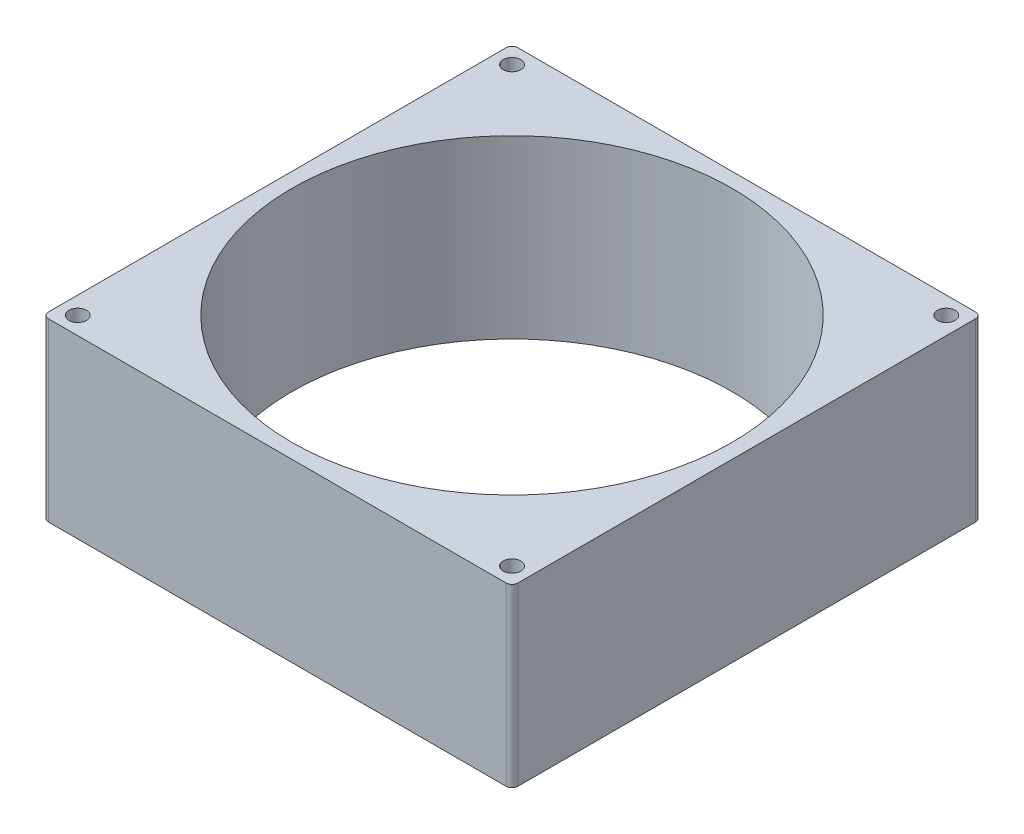
ISO-10303-21;
HEADER;
FILE_DESCRIPTION(('STEP AP214'),'2;1');
FILE_NAME('part.step','',(''),(''),'','','');
FILE_SCHEMA(('AUTOMOTIVE_DESIGN { 1 0 10303 214 1 1 1 1 }'));
ENDSEC;
DATA;
#1=APPLICATION_CONTEXT('core data for automotive mechanical design processes');
#2=APPLICATION_PROTOCOL_DEFINITION('international standard','automotive_design',2000,#1);
#3=PRODUCT_CONTEXT('',#1,'mechanical');
#4=PRODUCT('Part','Part','',(#3));
#5=PRODUCT_RELATED_PRODUCT_CATEGORY('part','',(#4));
#6=PRODUCT_DEFINITION_FORMATION('','',#4);
#7=PRODUCT_DEFINITION_CONTEXT('part definition',#1,'design');
#8=PRODUCT_DEFINITION('design','',#6,#7);
#9=PRODUCT_DEFINITION_SHAPE('','',#8);
#10=(LENGTH_UNIT() NAMED_UNIT(*) SI_UNIT(.MILLI.,.METRE.));
#11=(NAMED_UNIT(*) PLANE_ANGLE_UNIT() SI_UNIT($,.RADIAN.));
#12=(NAMED_UNIT(*) SI_UNIT($,.STERADIAN.) SOLID_ANGLE_UNIT());
#13=UNCERTAINTY_MEASURE_WITH_UNIT(LENGTH_MEASURE(1.E-05),#10,'distance_accuracy_value','');
#14=(GEOMETRIC_REPRESENTATION_CONTEXT(3) GLOBAL_UNCERTAINTY_ASSIGNED_CONTEXT((#13)) GLOBAL_UNIT_ASSIGNED_CONTEXT((#10,
#11,#12)) REPRESENTATION_CONTEXT('',''));
#15=CARTESIAN_POINT('',(0.,0.,0.));
#16=DIRECTION('',(0.,0.,1.));
#17=DIRECTION('',(1.,0.,0.));
#18=AXIS2_PLACEMENT_3D('',#15,#16,#17);
#19=CARTESIAN_POINT('',(0.,30.,0.));
#20=DIRECTION('',(0.,1.,0.));
#21=DIRECTION('',(0.,0.,1.));
#22=AXIS2_PLACEMENT_3D('',#19,#20,#21);
#23=PLANE('',#22);
#24=CARTESIAN_POINT('',(37.,30.,37.));
#25=DIRECTION('',(0.,1.,0.));
#26=DIRECTION('',(0.,0.,1.));
#27=AXIS2_PLACEMENT_3D('',#24,#25,#26);
#28=CIRCLE('',#27,1.5);
#29=CARTESIAN_POINT('',(37.,30.,38.5));
#30=VERTEX_POINT('',#29);
#31=EDGE_CURVE('E189',#30,#30,#28,.T.);
#32=ORIENTED_EDGE('',*,*,#31,.F.);
#33=EDGE_LOOP('',(#32));
#34=FACE_BOUND('',#33,.T.);
#35=CARTESIAN_POINT('',(-37.,30.,-37.));
#36=DIRECTION('',(0.,1.,0.));
#37=DIRECTION('',(0.,0.,1.));
#38=AXIS2_PLACEMENT_3D('',#35,#36,#37);
#39=CIRCLE('',#38,1.5);
#40=CARTESIAN_POINT('',(-37.,30.,-35.5));
#41=VERTEX_POINT('',#40);
#42=EDGE_CURVE('E178',#41,#41,#39,.T.);
#43=ORIENTED_EDGE('',*,*,#42,.F.);
#44=EDGE_LOOP('',(#43));
#45=FACE_BOUND('',#44,.T.);
#46=DIRECTION('',(0.,0.,1.));
#47=VECTOR('',#46,1.);
#48=CARTESIAN_POINT('',(-40.,30.,-40.));
#49=LINE('',#48,#47);
#50=CARTESIAN_POINT('',(-40.,30.,-39.));
#51=VERTEX_POINT('',#50);
#52=CARTESIAN_POINT('',(-40.,30.,39.));
#53=VERTEX_POINT('',#52);
#54=EDGE_CURVE('E173',#51,#53,#49,.T.);
#55=ORIENTED_EDGE('',*,*,#54,.T.);
#56=CARTESIAN_POINT('',(-39.,30.,39.));
#57=DIRECTION('',(0.,1.,0.));
#58=DIRECTION('',(0.,0.,1.));
#59=AXIS2_PLACEMENT_3D('',#56,#57,#58);
#60=CIRCLE('',#59,1.);
#61=CARTESIAN_POINT('',(-39.,30.,40.));
#62=VERTEX_POINT('',#61);
#63=EDGE_CURVE('E150',#53,#62,#60,.T.);
#64=ORIENTED_EDGE('',*,*,#63,.T.);
#65=DIRECTION('',(1.,0.,0.));
#66=VECTOR('',#65,1.);
#67=CARTESIAN_POINT('',(-40.,30.,40.));
#68=LINE('',#67,#66);
#69=CARTESIAN_POINT('',(39.,30.,40.));
#70=VERTEX_POINT('',#69);
#71=EDGE_CURVE('E121',#62,#70,#68,.T.);
#72=ORIENTED_EDGE('',*,*,#71,.T.);
#73=CARTESIAN_POINT('',(39.,30.,39.));
#74=DIRECTION('',(0.,1.,0.));
#75=DIRECTION('',(0.,0.,1.));
#76=AXIS2_PLACEMENT_3D('',#73,#74,#75);
#77=CIRCLE('',#76,1.);
#78=CARTESIAN_POINT('',(40.,30.,39.));
#79=VERTEX_POINT('',#78);
#80=EDGE_CURVE('E145',#70,#79,#77,.T.);
#81=ORIENTED_EDGE('',*,*,#80,.T.);
#82=DIRECTION('',(0.,0.,-1.));
#83=VECTOR('',#82,1.);
#84=CARTESIAN_POINT('',(40.,30.,-40.));
#85=LINE('',#84,#83);
#86=CARTESIAN_POINT('',(40.,30.,-39.));
#87=VERTEX_POINT('',#86);
#88=EDGE_CURVE('E128',#79,#87,#85,.T.);
#89=ORIENTED_EDGE('',*,*,#88,.T.);
#90=CARTESIAN_POINT('',(39.,30.,-39.));
#91=DIRECTION('',(0.,1.,0.));
#92=DIRECTION('',(0.,0.,1.));
#93=AXIS2_PLACEMENT_3D('',#90,#91,#92);
#94=CIRCLE('',#93,1.);
#95=CARTESIAN_POINT('',(39.,30.,-40.));
#96=VERTEX_POINT('',#95);
#97=EDGE_CURVE('E57',#87,#96,#94,.T.);
#98=ORIENTED_EDGE('',*,*,#97,.T.);
#99=DIRECTION('',(-1.,0.,0.));
#100=VECTOR('',#99,1.);
#101=CARTESIAN_POINT('',(-40.,30.,-40.));
#102=LINE('',#101,#100);
#103=CARTESIAN_POINT('',(-39.,30.,-40.));
#104=VERTEX_POINT('',#103);
#105=EDGE_CURVE('E131',#96,#104,#102,.T.);
#106=ORIENTED_EDGE('',*,*,#105,.T.);
#107=CARTESIAN_POINT('',(-39.,30.,-39.));
#108=DIRECTION('',(0.,1.,0.));
#109=DIRECTION('',(0.,0.,1.));
#110=AXIS2_PLACEMENT_3D('',#107,#108,#109);
#111=CIRCLE('',#110,1.);
#112=EDGE_CURVE('E148',#104,#51,#111,.T.);
#113=ORIENTED_EDGE('',*,*,#112,.T.);
#114=EDGE_LOOP('',(#55,#64,#72,#81,#89,#98,#106,#113));
#115=FACE_BOUND('',#114,.T.);
#116=CARTESIAN_POINT('',(0.,30.,0.));
#117=DIRECTION('',(0.,1.,0.));
#118=DIRECTION('',(0.,0.,1.));
#119=AXIS2_PLACEMENT_3D('',#116,#117,#118);
#120=CIRCLE('',#119,37.5);
#121=CARTESIAN_POINT('',(0.,30.,37.5));
#122=VERTEX_POINT('',#121);
#123=EDGE_CURVE('E166',#122,#122,#120,.T.);
#124=ORIENTED_EDGE('',*,*,#123,.F.);
#125=EDGE_LOOP('',(#124));
#126=FACE_BOUND('',#125,.T.);
#127=CARTESIAN_POINT('',(37.,30.,-37.));
#128=DIRECTION('',(0.,1.,0.));
#129=DIRECTION('',(0.,0.,1.));
#130=AXIS2_PLACEMENT_3D('',#127,#128,#129);
#131=CIRCLE('',#130,1.5);
#132=CARTESIAN_POINT('',(37.,30.,-35.5));
#133=VERTEX_POINT('',#132);
#134=EDGE_CURVE('E183',#133,#133,#131,.T.);
#135=ORIENTED_EDGE('',*,*,#134,.F.);
#136=EDGE_LOOP('',(#135));
#137=FACE_BOUND('',#136,.T.);
#138=CARTESIAN_POINT('',(-37.,30.,37.));
#139=DIRECTION('',(0.,1.,0.));
#140=DIRECTION('',(0.,0.,1.));
#141=AXIS2_PLACEMENT_3D('',#138,#139,#140);
#142=CIRCLE('',#141,1.5);
#143=CARTESIAN_POINT('',(-37.,30.,38.5));
#144=VERTEX_POINT('',#143);
#145=EDGE_CURVE('E195',#144,#144,#142,.T.);
#146=ORIENTED_EDGE('',*,*,#145,.F.);
#147=EDGE_LOOP('',(#146));
#148=FACE_BOUND('',#147,.T.);
#149=ADVANCED_FACE('F35',(#34,#45,#115,#126,#137,#148),#23,.T.);
#150=CARTESIAN_POINT('',(0.,0.,0.));
#151=DIRECTION('',(0.,1.,0.));
#152=DIRECTION('',(0.,0.,1.));
#153=AXIS2_PLACEMENT_3D('',#150,#151,#152);
#154=PLANE('',#153);
#155=CARTESIAN_POINT('',(37.,0.,37.));
#156=DIRECTION('',(0.,1.,0.));
#157=DIRECTION('',(0.,0.,1.));
#158=AXIS2_PLACEMENT_3D('',#155,#156,#157);
#159=CIRCLE('',#158,1.5);
#160=CARTESIAN_POINT('',(37.,0.,38.5));
#161=VERTEX_POINT('',#160);
#162=EDGE_CURVE('E192',#161,#161,#159,.T.);
#163=ORIENTED_EDGE('',*,*,#162,.T.);
#164=EDGE_LOOP('',(#163));
#165=FACE_BOUND('',#164,.T.);
#166=CARTESIAN_POINT('',(-37.,0.,-37.));
#167=DIRECTION('',(0.,1.,0.));
#168=DIRECTION('',(0.,0.,1.));
#169=AXIS2_PLACEMENT_3D('',#166,#167,#168);
#170=CIRCLE('',#169,1.5);
#171=CARTESIAN_POINT('',(-37.,0.,-35.5));
#172=VERTEX_POINT('',#171);
#173=EDGE_CURVE('E180',#172,#172,#170,.T.);
#174=ORIENTED_EDGE('',*,*,#173,.T.);
#175=EDGE_LOOP('',(#174));
#176=FACE_BOUND('',#175,.T.);
#177=DIRECTION('',(1.,0.,0.));
#178=VECTOR('',#177,1.);
#179=CARTESIAN_POINT('',(-40.,0.,40.));
#180=LINE('',#179,#178);
#181=CARTESIAN_POINT('',(-39.,0.,40.));
#182=VERTEX_POINT('',#181);
#183=CARTESIAN_POINT('',(39.,0.,40.));
#184=VERTEX_POINT('',#183);
#185=EDGE_CURVE('E118',#182,#184,#180,.T.);
#186=ORIENTED_EDGE('',*,*,#185,.F.);
#187=CARTESIAN_POINT('',(-39.,0.,39.));
#188=DIRECTION('',(0.,1.,0.));
#189=DIRECTION('',(0.,0.,1.));
#190=AXIS2_PLACEMENT_3D('',#187,#188,#189);
#191=CIRCLE('',#190,1.);
#192=CARTESIAN_POINT('',(-40.,0.,39.));
#193=VERTEX_POINT('',#192);
#194=EDGE_CURVE('E101',#182,#193,#191,.F.);
#195=ORIENTED_EDGE('',*,*,#194,.T.);
#196=DIRECTION('',(0.,0.,1.));
#197=VECTOR('',#196,1.);
#198=CARTESIAN_POINT('',(-40.,0.,-40.));
#199=LINE('',#198,#197);
#200=CARTESIAN_POINT('',(-40.,0.,-39.));
#201=VERTEX_POINT('',#200);
#202=EDGE_CURVE('E129',#201,#193,#199,.T.);
#203=ORIENTED_EDGE('',*,*,#202,.F.);
#204=CARTESIAN_POINT('',(-39.,0.,-39.));
#205=DIRECTION('',(0.,1.,0.));
#206=DIRECTION('',(0.,0.,1.));
#207=AXIS2_PLACEMENT_3D('',#204,#205,#206);
#208=CIRCLE('',#207,1.);
#209=CARTESIAN_POINT('',(-39.,0.,-40.));
#210=VERTEX_POINT('',#209);
#211=EDGE_CURVE('E112',#201,#210,#208,.F.);
#212=ORIENTED_EDGE('',*,*,#211,.T.);
#213=DIRECTION('',(-1.,0.,0.));
#214=VECTOR('',#213,1.);
#215=CARTESIAN_POINT('',(-40.,0.,-40.));
#216=LINE('',#215,#214);
#217=CARTESIAN_POINT('',(39.,0.,-40.));
#218=VERTEX_POINT('',#217);
#219=EDGE_CURVE('E133',#218,#210,#216,.T.);
#220=ORIENTED_EDGE('',*,*,#219,.F.);
#221=CARTESIAN_POINT('',(39.,0.,-39.));
#222=DIRECTION('',(0.,1.,0.));
#223=DIRECTION('',(0.,0.,1.));
#224=AXIS2_PLACEMENT_3D('',#221,#222,#223);
#225=CIRCLE('',#224,1.);
#226=CARTESIAN_POINT('',(40.,0.,-39.));
#227=VERTEX_POINT('',#226);
#228=EDGE_CURVE('E139',#218,#227,#225,.F.);
#229=ORIENTED_EDGE('',*,*,#228,.T.);
#230=DIRECTION('',(0.,0.,-1.));
#231=VECTOR('',#230,1.);
#232=CARTESIAN_POINT('',(40.,0.,-40.));
#233=LINE('',#232,#231);
#234=CARTESIAN_POINT('',(40.,0.,39.));
#235=VERTEX_POINT('',#234);
#236=EDGE_CURVE('E161',#235,#227,#233,.T.);
#237=ORIENTED_EDGE('',*,*,#236,.F.);
#238=CARTESIAN_POINT('',(39.,0.,39.));
#239=DIRECTION('',(0.,1.,0.));
#240=DIRECTION('',(0.,0.,1.));
#241=AXIS2_PLACEMENT_3D('',#238,#239,#240);
#242=CIRCLE('',#241,1.);
#243=EDGE_CURVE('E122',#235,#184,#242,.F.);
#244=ORIENTED_EDGE('',*,*,#243,.T.);
#245=EDGE_LOOP('',(#186,#195,#203,#212,#220,#229,#237,#244));
#246=FACE_BOUND('',#245,.T.);
#247=CARTESIAN_POINT('',(0.,0.,0.));
#248=DIRECTION('',(0.,1.,0.));
#249=DIRECTION('',(0.,0.,1.));
#250=AXIS2_PLACEMENT_3D('',#247,#248,#249);
#251=CIRCLE('',#250,37.5);
#252=CARTESIAN_POINT('',(0.,0.,37.5));
#253=VERTEX_POINT('',#252);
#254=EDGE_CURVE('E169',#253,#253,#251,.T.);
#255=ORIENTED_EDGE('',*,*,#254,.T.);
#256=EDGE_LOOP('',(#255));
#257=FACE_BOUND('',#256,.T.);
#258=CARTESIAN_POINT('',(37.,0.,-37.));
#259=DIRECTION('',(0.,1.,0.));
#260=DIRECTION('',(0.,0.,1.));
#261=AXIS2_PLACEMENT_3D('',#258,#259,#260);
#262=CIRCLE('',#261,1.5);
#263=CARTESIAN_POINT('',(37.,0.,-35.5));
#264=VERTEX_POINT('',#263);
#265=EDGE_CURVE('E186',#264,#264,#262,.T.);
#266=ORIENTED_EDGE('',*,*,#265,.T.);
#267=EDGE_LOOP('',(#266));
#268=FACE_BOUND('',#267,.T.);
#269=CARTESIAN_POINT('',(-37.,0.,37.));
#270=DIRECTION('',(0.,1.,0.));
#271=DIRECTION('',(0.,0.,1.));
#272=AXIS2_PLACEMENT_3D('',#269,#270,#271);
#273=CIRCLE('',#272,1.5);
#274=CARTESIAN_POINT('',(-37.,0.,38.5));
#275=VERTEX_POINT('',#274);
#276=EDGE_CURVE('E198',#275,#275,#273,.T.);
#277=ORIENTED_EDGE('',*,*,#276,.T.);
#278=EDGE_LOOP('',(#277));
#279=FACE_BOUND('',#278,.T.);
#280=ADVANCED_FACE('F125',(#165,#176,#246,#257,#268,#279),#154,.F.);
#281=CARTESIAN_POINT('',(40.,30.,-40.));
#282=DIRECTION('',(-1.,0.,0.));
#283=DIRECTION('',(0.,0.,1.));
#284=AXIS2_PLACEMENT_3D('',#281,#282,#283);
#285=PLANE('',#284);
#286=ORIENTED_EDGE('',*,*,#236,.T.);
#287=DIRECTION('',(0.,-1.,0.));
#288=VECTOR('',#287,1.);
#289=CARTESIAN_POINT('',(40.,30.,-39.));
#290=LINE('',#289,#288);
#291=EDGE_CURVE('E11',#227,#87,#290,.F.);
#292=ORIENTED_EDGE('',*,*,#291,.T.);
#293=ORIENTED_EDGE('',*,*,#88,.F.);
#294=DIRECTION('',(0.,-1.,0.));
#295=VECTOR('',#294,1.);
#296=CARTESIAN_POINT('',(40.,30.,39.));
#297=LINE('',#296,#295);
#298=EDGE_CURVE('E43',#79,#235,#297,.T.);
#299=ORIENTED_EDGE('',*,*,#298,.T.);
#300=EDGE_LOOP('',(#286,#292,#293,#299));
#301=FACE_BOUND('',#300,.T.);
#302=ADVANCED_FACE('F160',(#301),#285,.F.);
#303=CARTESIAN_POINT('',(-40.,30.,-40.));
#304=DIRECTION('',(0.,0.,1.));
#305=DIRECTION('',(1.,0.,0.));
#306=AXIS2_PLACEMENT_3D('',#303,#304,#305);
#307=PLANE('',#306);
#308=ORIENTED_EDGE('',*,*,#219,.T.);
#309=DIRECTION('',(0.,-1.,0.));
#310=VECTOR('',#309,1.);
#311=CARTESIAN_POINT('',(-39.,30.,-40.));
#312=LINE('',#311,#310);
#313=EDGE_CURVE('E50',#210,#104,#312,.F.);
#314=ORIENTED_EDGE('',*,*,#313,.T.);
#315=ORIENTED_EDGE('',*,*,#105,.F.);
#316=DIRECTION('',(0.,-1.,0.));
#317=VECTOR('',#316,1.);
#318=CARTESIAN_POINT('',(39.,30.,-40.));
#319=LINE('',#318,#317);
#320=EDGE_CURVE('E152',#96,#218,#319,.T.);
#321=ORIENTED_EDGE('',*,*,#320,.T.);
#322=EDGE_LOOP('',(#308,#314,#315,#321));
#323=FACE_BOUND('',#322,.T.);
#324=ADVANCED_FACE('F226',(#323),#307,.F.);
#325=CARTESIAN_POINT('',(-40.,30.,-40.));
#326=DIRECTION('',(1.,0.,0.));
#327=DIRECTION('',(0.,0.,-1.));
#328=AXIS2_PLACEMENT_3D('',#325,#326,#327);
#329=PLANE('',#328);
#330=ORIENTED_EDGE('',*,*,#202,.T.);
#331=DIRECTION('',(0.,-1.,0.));
#332=VECTOR('',#331,1.);
#333=CARTESIAN_POINT('',(-40.,30.,39.));
#334=LINE('',#333,#332);
#335=EDGE_CURVE('E106',#193,#53,#334,.F.);
#336=ORIENTED_EDGE('',*,*,#335,.T.);
#337=ORIENTED_EDGE('',*,*,#54,.F.);
#338=DIRECTION('',(0.,-1.,0.));
#339=VECTOR('',#338,1.);
#340=CARTESIAN_POINT('',(-40.,30.,-39.));
#341=LINE('',#340,#339);
#342=EDGE_CURVE('E111',#51,#201,#341,.T.);
#343=ORIENTED_EDGE('',*,*,#342,.T.);
#344=EDGE_LOOP('',(#330,#336,#337,#343));
#345=FACE_BOUND('',#344,.T.);
#346=ADVANCED_FACE('F223',(#345),#329,.F.);
#347=CARTESIAN_POINT('',(-40.,30.,40.));
#348=DIRECTION('',(0.,0.,-1.));
#349=DIRECTION('',(-1.,0.,0.));
#350=AXIS2_PLACEMENT_3D('',#347,#348,#349);
#351=PLANE('',#350);
#352=ORIENTED_EDGE('',*,*,#71,.F.);
#353=DIRECTION('',(0.,-1.,0.));
#354=VECTOR('',#353,1.);
#355=CARTESIAN_POINT('',(-39.,30.,40.));
#356=LINE('',#355,#354);
#357=EDGE_CURVE('E105',#62,#182,#356,.T.);
#358=ORIENTED_EDGE('',*,*,#357,.T.);
#359=ORIENTED_EDGE('',*,*,#185,.T.);
#360=DIRECTION('',(0.,-1.,0.));
#361=VECTOR('',#360,1.);
#362=CARTESIAN_POINT('',(39.,30.,40.));
#363=LINE('',#362,#361);
#364=EDGE_CURVE('E123',#184,#70,#363,.F.);
#365=ORIENTED_EDGE('',*,*,#364,.T.);
#366=EDGE_LOOP('',(#352,#358,#359,#365));
#367=FACE_BOUND('',#366,.T.);
#368=ADVANCED_FACE('F117',(#367),#351,.F.);
#369=CARTESIAN_POINT('',(0.,30.,0.));
#370=DIRECTION('',(0.,-1.,0.));
#371=DIRECTION('',(0.,0.,-1.));
#372=AXIS2_PLACEMENT_3D('',#369,#370,#371);
#373=CYLINDRICAL_SURFACE('',#372,37.5);
#374=ORIENTED_EDGE('',*,*,#123,.T.);
#375=EDGE_LOOP('',(#374));
#376=FACE_BOUND('',#375,.T.);
#377=ORIENTED_EDGE('',*,*,#254,.F.);
#378=EDGE_LOOP('',(#377));
#379=FACE_BOUND('',#378,.T.);
#380=ADVANCED_FACE('F218',(#376,#379),#373,.F.);
#381=CARTESIAN_POINT('',(-37.,30.,-37.));
#382=DIRECTION('',(0.,-1.,0.));
#383=DIRECTION('',(0.,0.,-1.));
#384=AXIS2_PLACEMENT_3D('',#381,#382,#383);
#385=CYLINDRICAL_SURFACE('',#384,1.5);
#386=ORIENTED_EDGE('',*,*,#42,.T.);
#387=EDGE_LOOP('',(#386));
#388=FACE_BOUND('',#387,.T.);
#389=ORIENTED_EDGE('',*,*,#173,.F.);
#390=EDGE_LOOP('',(#389));
#391=FACE_BOUND('',#390,.T.);
#392=ADVANCED_FACE('F256',(#388,#391),#385,.F.);
#393=CARTESIAN_POINT('',(37.,30.,-37.));
#394=DIRECTION('',(0.,-1.,0.));
#395=DIRECTION('',(0.,0.,-1.));
#396=AXIS2_PLACEMENT_3D('',#393,#394,#395);
#397=CYLINDRICAL_SURFACE('',#396,1.5);
#398=ORIENTED_EDGE('',*,*,#134,.T.);
#399=EDGE_LOOP('',(#398));
#400=FACE_BOUND('',#399,.T.);
#401=ORIENTED_EDGE('',*,*,#265,.F.);
#402=EDGE_LOOP('',(#401));
#403=FACE_BOUND('',#402,.T.);
#404=ADVANCED_FACE('F252',(#400,#403),#397,.F.);
#405=CARTESIAN_POINT('',(37.,30.,37.));
#406=DIRECTION('',(0.,-1.,0.));
#407=DIRECTION('',(0.,0.,-1.));
#408=AXIS2_PLACEMENT_3D('',#405,#406,#407);
#409=CYLINDRICAL_SURFACE('',#408,1.5);
#410=ORIENTED_EDGE('',*,*,#31,.T.);
#411=EDGE_LOOP('',(#410));
#412=FACE_BOUND('',#411,.T.);
#413=ORIENTED_EDGE('',*,*,#162,.F.);
#414=EDGE_LOOP('',(#413));
#415=FACE_BOUND('',#414,.T.);
#416=ADVANCED_FACE('F255',(#412,#415),#409,.F.);
#417=CARTESIAN_POINT('',(-37.,30.,37.));
#418=DIRECTION('',(0.,-1.,0.));
#419=DIRECTION('',(0.,0.,-1.));
#420=AXIS2_PLACEMENT_3D('',#417,#418,#419);
#421=CYLINDRICAL_SURFACE('',#420,1.5);
#422=ORIENTED_EDGE('',*,*,#145,.T.);
#423=EDGE_LOOP('',(#422));
#424=FACE_BOUND('',#423,.T.);
#425=ORIENTED_EDGE('',*,*,#276,.F.);
#426=EDGE_LOOP('',(#425));
#427=FACE_BOUND('',#426,.T.);
#428=ADVANCED_FACE('F204',(#424,#427),#421,.F.);
#429=CARTESIAN_POINT('',(-39.,30.,39.));
#430=DIRECTION('',(0.,-1.,0.));
#431=DIRECTION('',(0.,0.,-1.));
#432=AXIS2_PLACEMENT_3D('',#429,#430,#431);
#433=CYLINDRICAL_SURFACE('',#432,1.);
#434=ORIENTED_EDGE('',*,*,#63,.F.);
#435=ORIENTED_EDGE('',*,*,#335,.F.);
#436=ORIENTED_EDGE('',*,*,#194,.F.);
#437=ORIENTED_EDGE('',*,*,#357,.F.);
#438=EDGE_LOOP('',(#434,#435,#436,#437));
#439=FACE_BOUND('',#438,.T.);
#440=ADVANCED_FACE('F104',(#439),#433,.T.);
#441=CARTESIAN_POINT('',(-39.,30.,-39.));
#442=DIRECTION('',(0.,-1.,0.));
#443=DIRECTION('',(0.,0.,-1.));
#444=AXIS2_PLACEMENT_3D('',#441,#442,#443);
#445=CYLINDRICAL_SURFACE('',#444,1.);
#446=ORIENTED_EDGE('',*,*,#112,.F.);
#447=ORIENTED_EDGE('',*,*,#313,.F.);
#448=ORIENTED_EDGE('',*,*,#211,.F.);
#449=ORIENTED_EDGE('',*,*,#342,.F.);
#450=EDGE_LOOP('',(#446,#447,#448,#449));
#451=FACE_BOUND('',#450,.T.);
#452=ADVANCED_FACE('F234',(#451),#445,.T.);
#453=CARTESIAN_POINT('',(39.,30.,-39.));
#454=DIRECTION('',(0.,-1.,0.));
#455=DIRECTION('',(0.,0.,-1.));
#456=AXIS2_PLACEMENT_3D('',#453,#454,#455);
#457=CYLINDRICAL_SURFACE('',#456,1.);
#458=ORIENTED_EDGE('',*,*,#97,.F.);
#459=ORIENTED_EDGE('',*,*,#291,.F.);
#460=ORIENTED_EDGE('',*,*,#228,.F.);
#461=ORIENTED_EDGE('',*,*,#320,.F.);
#462=EDGE_LOOP('',(#458,#459,#460,#461));
#463=FACE_BOUND('',#462,.T.);
#464=ADVANCED_FACE('F236',(#463),#457,.T.);
#465=CARTESIAN_POINT('',(39.,30.,39.));
#466=DIRECTION('',(0.,-1.,0.));
#467=DIRECTION('',(0.,0.,-1.));
#468=AXIS2_PLACEMENT_3D('',#465,#466,#467);
#469=CYLINDRICAL_SURFACE('',#468,1.);
#470=ORIENTED_EDGE('',*,*,#80,.F.);
#471=ORIENTED_EDGE('',*,*,#364,.F.);
#472=ORIENTED_EDGE('',*,*,#243,.F.);
#473=ORIENTED_EDGE('',*,*,#298,.F.);
#474=EDGE_LOOP('',(#470,#471,#472,#473));
#475=FACE_BOUND('',#474,.T.);
#476=ADVANCED_FACE('F37',(#475),#469,.T.);
#477=CLOSED_SHELL('',(#149,#280,#302,#324,#346,#368,#380,#392,#404,#416,#428,#440,#452,#464,#476));
#478=MANIFOLD_SOLID_BREP('B2',#477);
#479=ADVANCED_BREP_SHAPE_REPRESENTATION('',(#18,#478),#14);
#480=SHAPE_DEFINITION_REPRESENTATION(#9,#479);
ENDSEC;
END-ISO-10303-21;
